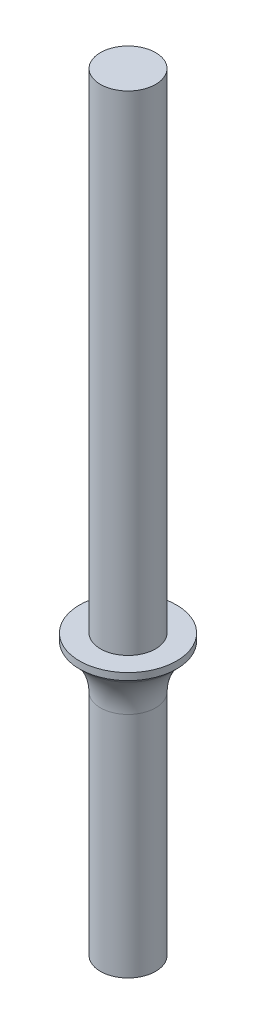
ISO-10303-21;
HEADER;
FILE_DESCRIPTION(('STEP AP214'),'2;1');
FILE_NAME('part.step','',(''),(''),'','','');
FILE_SCHEMA(('AUTOMOTIVE_DESIGN { 1 0 10303 214 1 1 1 1 }'));
ENDSEC;
DATA;
#1=APPLICATION_CONTEXT('core data for automotive mechanical design processes');
#2=APPLICATION_PROTOCOL_DEFINITION('international standard','automotive_design',2000,#1);
#3=PRODUCT_CONTEXT('',#1,'mechanical');
#4=PRODUCT('Part','Part','',(#3));
#5=PRODUCT_RELATED_PRODUCT_CATEGORY('part','',(#4));
#6=PRODUCT_DEFINITION_FORMATION('','',#4);
#7=PRODUCT_DEFINITION_CONTEXT('part definition',#1,'design');
#8=PRODUCT_DEFINITION('design','',#6,#7);
#9=PRODUCT_DEFINITION_SHAPE('','',#8);
#10=(LENGTH_UNIT() NAMED_UNIT(*) SI_UNIT(.MILLI.,.METRE.));
#11=(NAMED_UNIT(*) PLANE_ANGLE_UNIT() SI_UNIT($,.RADIAN.));
#12=(NAMED_UNIT(*) SI_UNIT($,.STERADIAN.) SOLID_ANGLE_UNIT());
#13=UNCERTAINTY_MEASURE_WITH_UNIT(LENGTH_MEASURE(1.E-05),#10,'distance_accuracy_value','');
#14=(GEOMETRIC_REPRESENTATION_CONTEXT(3) GLOBAL_UNCERTAINTY_ASSIGNED_CONTEXT((#13)) GLOBAL_UNIT_ASSIGNED_CONTEXT((#10,
#11,#12)) REPRESENTATION_CONTEXT('',''));
#15=CARTESIAN_POINT('',(0.,0.,0.));
#16=DIRECTION('',(0.,0.,1.));
#17=DIRECTION('',(1.,0.,0.));
#18=AXIS2_PLACEMENT_3D('',#15,#16,#17);
#19=CARTESIAN_POINT('',(0.,110.,0.));
#20=DIRECTION('',(0.,-1.,0.));
#21=DIRECTION('',(0.,0.,-1.));
#22=AXIS2_PLACEMENT_3D('',#19,#20,#21);
#23=CYLINDRICAL_SURFACE('',#22,3.95);
#24=CARTESIAN_POINT('',(0.,110.,0.));
#25=DIRECTION('',(0.,1.,0.));
#26=DIRECTION('',(0.,0.,1.));
#27=AXIS2_PLACEMENT_3D('',#24,#25,#26);
#28=CIRCLE('',#27,3.95);
#29=CARTESIAN_POINT('',(0.,110.,3.95));
#30=VERTEX_POINT('',#29);
#31=EDGE_CURVE('E57',#30,#30,#28,.T.);
#32=ORIENTED_EDGE('',*,*,#31,.F.);
#33=EDGE_LOOP('',(#32));
#34=FACE_BOUND('',#33,.T.);
#35=CARTESIAN_POINT('',(0.,40.,0.));
#36=DIRECTION('',(0.,-1.,0.));
#37=DIRECTION('',(0.,0.,-1.));
#38=AXIS2_PLACEMENT_3D('',#35,#36,#37);
#39=CIRCLE('',#38,3.95);
#40=CARTESIAN_POINT('',(0.,40.,-3.95));
#41=VERTEX_POINT('',#40);
#42=EDGE_CURVE('E52',#41,#41,#39,.T.);
#43=ORIENTED_EDGE('',*,*,#42,.F.);
#44=EDGE_LOOP('',(#43));
#45=FACE_BOUND('',#44,.T.);
#46=ADVANCED_FACE('F39',(#34,#45),#23,.T.);
#47=CARTESIAN_POINT('',(0.,110.,0.));
#48=DIRECTION('',(0.,1.,0.));
#49=DIRECTION('',(0.,0.,1.));
#50=AXIS2_PLACEMENT_3D('',#47,#48,#49);
#51=PLANE('',#50);
#52=ORIENTED_EDGE('',*,*,#31,.T.);
#53=EDGE_LOOP('',(#52));
#54=FACE_BOUND('',#53,.T.);
#55=ADVANCED_FACE('F91',(#54),#51,.T.);
#56=CARTESIAN_POINT('',(0.,40.,0.));
#57=DIRECTION('',(0.,-1.,0.));
#58=DIRECTION('',(0.,0.,-1.));
#59=AXIS2_PLACEMENT_3D('',#56,#57,#58);
#60=CYLINDRICAL_SURFACE('',#59,6.95);
#61=CARTESIAN_POINT('',(0.,40.,0.));
#62=DIRECTION('',(0.,-1.,0.));
#63=DIRECTION('',(0.,0.,-1.));
#64=AXIS2_PLACEMENT_3D('',#61,#62,#63);
#65=CIRCLE('',#64,6.95);
#66=CARTESIAN_POINT('',(0.,40.,-6.95));
#67=VERTEX_POINT('',#66);
#68=EDGE_CURVE('E64',#67,#67,#65,.T.);
#69=ORIENTED_EDGE('',*,*,#68,.T.);
#70=EDGE_LOOP('',(#69));
#71=FACE_BOUND('',#70,.T.);
#72=CARTESIAN_POINT('',(0.,39.,0.));
#73=DIRECTION('',(0.,-1.,0.));
#74=DIRECTION('',(0.,0.,-1.));
#75=AXIS2_PLACEMENT_3D('',#72,#73,#74);
#76=CIRCLE('',#75,6.95);
#77=CARTESIAN_POINT('',(0.,39.,-6.95));
#78=VERTEX_POINT('',#77);
#79=EDGE_CURVE('E68',#78,#78,#76,.T.);
#80=ORIENTED_EDGE('',*,*,#79,.F.);
#81=EDGE_LOOP('',(#80));
#82=FACE_BOUND('',#81,.T.);
#83=ADVANCED_FACE('F76',(#71,#82),#60,.T.);
#84=CARTESIAN_POINT('',(0.,40.,0.));
#85=DIRECTION('',(0.,-1.,0.));
#86=DIRECTION('',(0.,0.,-1.));
#87=AXIS2_PLACEMENT_3D('',#84,#85,#86);
#88=PLANE('',#87);
#89=ORIENTED_EDGE('',*,*,#42,.T.);
#90=EDGE_LOOP('',(#89));
#91=FACE_BOUND('',#90,.T.);
#92=ORIENTED_EDGE('',*,*,#68,.F.);
#93=EDGE_LOOP('',(#92));
#94=FACE_BOUND('',#93,.T.);
#95=ADVANCED_FACE('F79',(#91,#94),#88,.F.);
#96=CARTESIAN_POINT('',(0.,0.,0.));
#97=DIRECTION('',(0.,1.,0.));
#98=DIRECTION('',(0.,0.,1.));
#99=AXIS2_PLACEMENT_3D('',#96,#97,#98);
#100=PLANE('',#99);
#101=CARTESIAN_POINT('',(0.,0.,0.));
#102=DIRECTION('',(0.,1.,0.));
#103=DIRECTION('',(0.,0.,1.));
#104=AXIS2_PLACEMENT_3D('',#101,#102,#103);
#105=CIRCLE('',#104,3.95);
#106=CARTESIAN_POINT('',(0.,0.,3.95));
#107=VERTEX_POINT('',#106);
#108=EDGE_CURVE('E60',#107,#107,#105,.T.);
#109=ORIENTED_EDGE('',*,*,#108,.F.);
#110=EDGE_LOOP('',(#109));
#111=FACE_BOUND('',#110,.T.);
#112=ADVANCED_FACE('F81',(#111),#100,.F.);
#113=CARTESIAN_POINT('',(0.,32.6862915010152,0.));
#114=DIRECTION('',(0.,-1.,0.));
#115=DIRECTION('',(0.,0.,-1.));
#116=AXIS2_PLACEMENT_3D('',#113,#114,#115);
#117=CIRCLE('',#116,3.95);
#118=CARTESIAN_POINT('',(0.,32.6862915010152,-3.95));
#119=VERTEX_POINT('',#118);
#120=EDGE_CURVE('E47',#119,#119,#117,.T.);
#121=ORIENTED_EDGE('',*,*,#120,.T.);
#122=EDGE_LOOP('',(#121));
#123=FACE_BOUND('',#122,.T.);
#124=ORIENTED_EDGE('',*,*,#108,.T.);
#125=EDGE_LOOP('',(#124));
#126=FACE_BOUND('',#125,.T.);
#127=ADVANCED_FACE('F88',(#123,#126),#23,.T.);
#128=CARTESIAN_POINT('',(0.,35.9999999999999,0.));
#129=DIRECTION('',(0.,1.,0.));
#130=DIRECTION('',(0.,0.,1.));
#131=AXIS2_PLACEMENT_3D('',#128,#129,#130);
#132=CONICAL_SURFACE('',#131,3.95,0.785398163397441);
#133=CARTESIAN_POINT('',(0.,38.3431457505075,0.));
#134=DIRECTION('',(0.,1.,0.));
#135=DIRECTION('',(0.,0.,1.));
#136=AXIS2_PLACEMENT_3D('',#133,#134,#135);
#137=CIRCLE('',#136,6.29314575050758);
#138=CARTESIAN_POINT('',(0.,38.3431457505075,6.29314575050758));
#139=VERTEX_POINT('',#138);
#140=EDGE_CURVE('E10',#139,#139,#137,.T.);
#141=ORIENTED_EDGE('',*,*,#140,.T.);
#142=EDGE_LOOP('',(#141));
#143=FACE_BOUND('',#142,.T.);
#144=ORIENTED_EDGE('',*,*,#79,.T.);
#145=EDGE_LOOP('',(#144));
#146=FACE_BOUND('',#145,.T.);
#147=ADVANCED_FACE('F104',(#143,#146),#132,.T.);
#148=CARTESIAN_POINT('',(0.,32.6862915010152,0.));
#149=DIRECTION('',(0.,-1.,0.));
#150=DIRECTION('',(0.,0.,-1.));
#151=AXIS2_PLACEMENT_3D('',#148,#149,#150);
#152=TOROIDAL_SURFACE('',#151,11.95,8.);
#153=ORIENTED_EDGE('',*,*,#140,.F.);
#154=EDGE_LOOP('',(#153));
#155=FACE_BOUND('',#154,.T.);
#156=ORIENTED_EDGE('',*,*,#120,.F.);
#157=EDGE_LOOP('',(#156));
#158=FACE_BOUND('',#157,.T.);
#159=ADVANCED_FACE('F41',(#155,#158),#152,.F.);
#160=CLOSED_SHELL('',(#46,#55,#83,#95,#112,#127,#147,#159));
#161=MANIFOLD_SOLID_BREP('B2',#160);
#162=ADVANCED_BREP_SHAPE_REPRESENTATION('',(#18,#161),#14);
#163=SHAPE_DEFINITION_REPRESENTATION(#9,#162);
ENDSEC;
END-ISO-10303-21;
